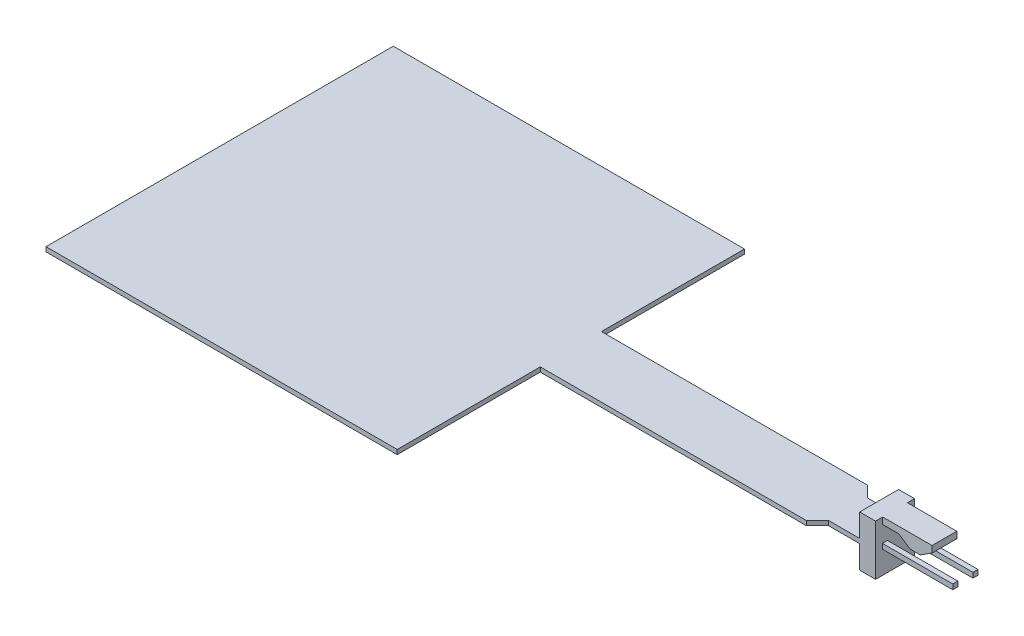
ISO-10303-21;
HEADER;
FILE_DESCRIPTION(('STEP AP214'),'2;1');
FILE_NAME('part.step','',(''),(''),'','','');
FILE_SCHEMA(('AUTOMOTIVE_DESIGN { 1 0 10303 214 1 1 1 1 }'));
ENDSEC;
DATA;
#1=APPLICATION_CONTEXT('core data for automotive mechanical design processes');
#2=APPLICATION_PROTOCOL_DEFINITION('international standard','automotive_design',2000,#1);
#3=PRODUCT_CONTEXT('',#1,'mechanical');
#4=PRODUCT('Part','Part','',(#3));
#5=PRODUCT_RELATED_PRODUCT_CATEGORY('part','',(#4));
#6=PRODUCT_DEFINITION_FORMATION('','',#4);
#7=PRODUCT_DEFINITION_CONTEXT('part definition',#1,'design');
#8=PRODUCT_DEFINITION('design','',#6,#7);
#9=PRODUCT_DEFINITION_SHAPE('','',#8);
#10=(LENGTH_UNIT() NAMED_UNIT(*) SI_UNIT(.MILLI.,.METRE.));
#11=(NAMED_UNIT(*) PLANE_ANGLE_UNIT() SI_UNIT($,.RADIAN.));
#12=(NAMED_UNIT(*) SI_UNIT($,.STERADIAN.) SOLID_ANGLE_UNIT());
#13=UNCERTAINTY_MEASURE_WITH_UNIT(LENGTH_MEASURE(1.E-05),#10,'distance_accuracy_value','');
#14=(GEOMETRIC_REPRESENTATION_CONTEXT(3) GLOBAL_UNCERTAINTY_ASSIGNED_CONTEXT((#13)) GLOBAL_UNIT_ASSIGNED_CONTEXT((#10,
#11,#12)) REPRESENTATION_CONTEXT('',''));
#15=CARTESIAN_POINT('',(0.,0.,0.));
#16=DIRECTION('',(0.,0.,1.));
#17=DIRECTION('',(1.,0.,0.));
#18=AXIS2_PLACEMENT_3D('',#15,#16,#17);
#19=CARTESIAN_POINT('',(62.9,0.,0.));
#20=DIRECTION('',(-1.,0.,0.));
#21=DIRECTION('',(0.,0.,1.));
#22=AXIS2_PLACEMENT_3D('',#19,#20,#21);
#23=PLANE('',#22);
#24=DIRECTION('',(0.,0.,-1.));
#25=VECTOR('',#24,1.);
#26=CARTESIAN_POINT('',(62.9,-0.3175,1.5875));
#27=LINE('',#26,#25);
#28=CARTESIAN_POINT('',(62.9,-0.3175,1.5875));
#29=VERTEX_POINT('',#28);
#30=CARTESIAN_POINT('',(62.9,-0.3175,0.9525));
#31=VERTEX_POINT('',#30);
#32=EDGE_CURVE('E289',#29,#31,#27,.T.);
#33=ORIENTED_EDGE('',*,*,#32,.F.);
#34=DIRECTION('',(0.,-1.,0.));
#35=VECTOR('',#34,1.);
#36=CARTESIAN_POINT('',(62.9,-0.3175,1.5875));
#37=LINE('',#36,#35);
#38=CARTESIAN_POINT('',(62.9,0.317500000000001,1.5875));
#39=VERTEX_POINT('',#38);
#40=EDGE_CURVE('E286',#39,#29,#37,.T.);
#41=ORIENTED_EDGE('',*,*,#40,.F.);
#42=DIRECTION('',(0.,0.,1.));
#43=VECTOR('',#42,1.);
#44=CARTESIAN_POINT('',(62.9,0.317500000000001,1.5875));
#45=LINE('',#44,#43);
#46=CARTESIAN_POINT('',(62.9,0.317500000000001,0.9525));
#47=VERTEX_POINT('',#46);
#48=EDGE_CURVE('E283',#47,#39,#45,.T.);
#49=ORIENTED_EDGE('',*,*,#48,.F.);
#50=DIRECTION('',(0.,1.,0.));
#51=VECTOR('',#50,1.);
#52=CARTESIAN_POINT('',(62.9,-0.3175,0.9525));
#53=LINE('',#52,#51);
#54=EDGE_CURVE('E280',#31,#47,#53,.T.);
#55=ORIENTED_EDGE('',*,*,#54,.F.);
#56=EDGE_LOOP('',(#33,#41,#49,#55));
#57=FACE_BOUND('',#56,.T.);
#58=DIRECTION('',(0.,0.,1.));
#59=VECTOR('',#58,1.);
#60=CARTESIAN_POINT('',(62.9,3.175,2.45));
#61=LINE('',#60,#59);
#62=CARTESIAN_POINT('',(62.9,3.175,-2.45));
#63=VERTEX_POINT('',#62);
#64=CARTESIAN_POINT('',(62.9,3.175,-1.555));
#65=VERTEX_POINT('',#64);
#66=EDGE_CURVE('E364',#63,#65,#61,.T.);
#67=ORIENTED_EDGE('',*,*,#66,.T.);
#68=DIRECTION('',(0.,-1.,0.));
#69=VECTOR('',#68,1.);
#70=CARTESIAN_POINT('',(62.9,2.355,-1.555));
#71=LINE('',#70,#69);
#72=CARTESIAN_POINT('',(62.9,2.355,-1.555));
#73=VERTEX_POINT('',#72);
#74=EDGE_CURVE('E279',#65,#73,#71,.T.);
#75=ORIENTED_EDGE('',*,*,#74,.T.);
#76=DIRECTION('',(0.,0.,-1.));
#77=VECTOR('',#76,1.);
#78=CARTESIAN_POINT('',(62.9,2.355,1.555));
#79=LINE('',#78,#77);
#80=CARTESIAN_POINT('',(62.9,2.355,1.555));
#81=VERTEX_POINT('',#80);
#82=EDGE_CURVE('E351',#81,#73,#79,.T.);
#83=ORIENTED_EDGE('',*,*,#82,.F.);
#84=DIRECTION('',(0.,-1.,0.));
#85=VECTOR('',#84,1.);
#86=CARTESIAN_POINT('',(62.9,2.355,1.555));
#87=LINE('',#86,#85);
#88=CARTESIAN_POINT('',(62.9,3.175,1.555));
#89=VERTEX_POINT('',#88);
#90=EDGE_CURVE('E306',#89,#81,#87,.T.);
#91=ORIENTED_EDGE('',*,*,#90,.F.);
#92=CARTESIAN_POINT('',(62.9,3.175,2.45));
#93=VERTEX_POINT('',#92);
#94=EDGE_CURVE('E363',#89,#93,#61,.T.);
#95=ORIENTED_EDGE('',*,*,#94,.T.);
#96=DIRECTION('',(0.,-1.,0.));
#97=VECTOR('',#96,1.);
#98=CARTESIAN_POINT('',(62.9,-3.175,2.45));
#99=LINE('',#98,#97);
#100=CARTESIAN_POINT('',(62.9,-3.175,2.45));
#101=VERTEX_POINT('',#100);
#102=EDGE_CURVE('E355',#93,#101,#99,.T.);
#103=ORIENTED_EDGE('',*,*,#102,.T.);
#104=DIRECTION('',(0.,0.,-1.));
#105=VECTOR('',#104,1.);
#106=CARTESIAN_POINT('',(62.9,-3.175,2.45));
#107=LINE('',#106,#105);
#108=CARTESIAN_POINT('',(62.9,-3.175,-2.45));
#109=VERTEX_POINT('',#108);
#110=EDGE_CURVE('E358',#101,#109,#107,.T.);
#111=ORIENTED_EDGE('',*,*,#110,.T.);
#112=DIRECTION('',(0.,1.,0.));
#113=VECTOR('',#112,1.);
#114=CARTESIAN_POINT('',(62.9,-3.175,-2.45));
#115=LINE('',#114,#113);
#116=EDGE_CURVE('E361',#109,#63,#115,.T.);
#117=ORIENTED_EDGE('',*,*,#116,.T.);
#118=EDGE_LOOP('',(#67,#75,#83,#91,#95,#103,#111,#117));
#119=FACE_BOUND('',#118,.T.);
#120=DIRECTION('',(0.,0.,-1.));
#121=VECTOR('',#120,1.);
#122=CARTESIAN_POINT('',(62.9,-0.3175,-0.9525));
#123=LINE('',#122,#121);
#124=CARTESIAN_POINT('',(62.9,-0.3175,-0.9525));
#125=VERTEX_POINT('',#124);
#126=CARTESIAN_POINT('',(62.9,-0.317499999999999,-1.5875));
#127=VERTEX_POINT('',#126);
#128=EDGE_CURVE('E49',#125,#127,#123,.T.);
#129=ORIENTED_EDGE('',*,*,#128,.F.);
#130=DIRECTION('',(0.,-1.,0.));
#131=VECTOR('',#130,1.);
#132=CARTESIAN_POINT('',(62.9,-0.3175,-0.9525));
#133=LINE('',#132,#131);
#134=CARTESIAN_POINT('',(62.9,0.317500000000001,-0.9525));
#135=VERTEX_POINT('',#134);
#136=EDGE_CURVE('E54',#135,#125,#133,.T.);
#137=ORIENTED_EDGE('',*,*,#136,.F.);
#138=DIRECTION('',(0.,0.,1.));
#139=VECTOR('',#138,1.);
#140=CARTESIAN_POINT('',(62.9,0.317500000000001,-0.9525));
#141=LINE('',#140,#139);
#142=CARTESIAN_POINT('',(62.9,0.317500000000001,-1.5875));
#143=VERTEX_POINT('',#142);
#144=EDGE_CURVE('E234',#143,#135,#141,.T.);
#145=ORIENTED_EDGE('',*,*,#144,.F.);
#146=DIRECTION('',(0.,1.,0.));
#147=VECTOR('',#146,1.);
#148=CARTESIAN_POINT('',(62.9,-0.317499999999999,-1.5875));
#149=LINE('',#148,#147);
#150=EDGE_CURVE('E237',#127,#143,#149,.T.);
#151=ORIENTED_EDGE('',*,*,#150,.F.);
#152=EDGE_LOOP('',(#129,#137,#145,#151));
#153=FACE_BOUND('',#152,.T.);
#154=ADVANCED_FACE('F34',(#57,#119,#153),#23,.F.);
#155=CARTESIAN_POINT('',(22.1,0.285,-3.85));
#156=DIRECTION('',(-1.,0.,0.));
#157=DIRECTION('',(0.,0.,1.));
#158=AXIS2_PLACEMENT_3D('',#155,#156,#157);
#159=PLANE('',#158);
#160=DIRECTION('',(0.,0.,-1.));
#161=VECTOR('',#160,1.);
#162=CARTESIAN_POINT('',(22.1,-0.285,-3.85));
#163=LINE('',#162,#161);
#164=CARTESIAN_POINT('',(22.1,-0.285,-3.85));
#165=VERTEX_POINT('',#164);
#166=CARTESIAN_POINT('',(22.1,-0.285,-21.85));
#167=VERTEX_POINT('',#166);
#168=EDGE_CURVE('E388',#165,#167,#163,.T.);
#169=ORIENTED_EDGE('',*,*,#168,.T.);
#170=DIRECTION('',(0.,-1.,0.));
#171=VECTOR('',#170,1.);
#172=CARTESIAN_POINT('',(22.1,0.285,-21.85));
#173=LINE('',#172,#171);
#174=CARTESIAN_POINT('',(22.1,0.285,-21.85));
#175=VERTEX_POINT('',#174);
#176=EDGE_CURVE('E12',#175,#167,#173,.T.);
#177=ORIENTED_EDGE('',*,*,#176,.F.);
#178=DIRECTION('',(0.,0.,-1.));
#179=VECTOR('',#178,1.);
#180=CARTESIAN_POINT('',(22.1,0.285,-3.85));
#181=LINE('',#180,#179);
#182=CARTESIAN_POINT('',(22.1,0.285,-3.85));
#183=VERTEX_POINT('',#182);
#184=EDGE_CURVE('E389',#183,#175,#181,.T.);
#185=ORIENTED_EDGE('',*,*,#184,.F.);
#186=DIRECTION('',(0.,-1.,0.));
#187=VECTOR('',#186,1.);
#188=CARTESIAN_POINT('',(22.1,0.285,-3.85));
#189=LINE('',#188,#187);
#190=EDGE_CURVE('E417',#183,#165,#189,.T.);
#191=ORIENTED_EDGE('',*,*,#190,.T.);
#192=EDGE_LOOP('',(#169,#177,#185,#191));
#193=FACE_BOUND('',#192,.T.);
#194=ADVANCED_FACE('F36',(#193),#159,.F.);
#195=CARTESIAN_POINT('',(-22.1,0.285,-21.85));
#196=DIRECTION('',(0.,0.,1.));
#197=DIRECTION('',(1.,0.,0.));
#198=AXIS2_PLACEMENT_3D('',#195,#196,#197);
#199=PLANE('',#198);
#200=DIRECTION('',(-1.,0.,0.));
#201=VECTOR('',#200,1.);
#202=CARTESIAN_POINT('',(-22.1,-0.285,-21.85));
#203=LINE('',#202,#201);
#204=CARTESIAN_POINT('',(-22.1,-0.285,-21.85));
#205=VERTEX_POINT('',#204);
#206=EDGE_CURVE('E420',#167,#205,#203,.T.);
#207=ORIENTED_EDGE('',*,*,#206,.T.);
#208=DIRECTION('',(0.,-1.,0.));
#209=VECTOR('',#208,1.);
#210=CARTESIAN_POINT('',(-22.1,0.285,-21.85));
#211=LINE('',#210,#209);
#212=CARTESIAN_POINT('',(-22.1,0.285,-21.85));
#213=VERTEX_POINT('',#212);
#214=EDGE_CURVE('E42',#213,#205,#211,.T.);
#215=ORIENTED_EDGE('',*,*,#214,.F.);
#216=DIRECTION('',(-1.,0.,0.));
#217=VECTOR('',#216,1.);
#218=CARTESIAN_POINT('',(-22.1,0.285,-21.85));
#219=LINE('',#218,#217);
#220=EDGE_CURVE('E392',#175,#213,#219,.T.);
#221=ORIENTED_EDGE('',*,*,#220,.F.);
#222=ORIENTED_EDGE('',*,*,#176,.T.);
#223=EDGE_LOOP('',(#207,#215,#221,#222));
#224=FACE_BOUND('',#223,.T.);
#225=ADVANCED_FACE('F492',(#224),#199,.F.);
#226=CARTESIAN_POINT('',(-22.1,0.285,21.85));
#227=DIRECTION('',(1.,0.,0.));
#228=DIRECTION('',(0.,0.,-1.));
#229=AXIS2_PLACEMENT_3D('',#226,#227,#228);
#230=PLANE('',#229);
#231=DIRECTION('',(0.,0.,1.));
#232=VECTOR('',#231,1.);
#233=CARTESIAN_POINT('',(-22.1,-0.285,21.85));
#234=LINE('',#233,#232);
#235=CARTESIAN_POINT('',(-22.1,-0.285,21.85));
#236=VERTEX_POINT('',#235);
#237=EDGE_CURVE('E422',#205,#236,#234,.T.);
#238=ORIENTED_EDGE('',*,*,#237,.T.);
#239=DIRECTION('',(0.,-1.,0.));
#240=VECTOR('',#239,1.);
#241=CARTESIAN_POINT('',(-22.1,0.285,21.85));
#242=LINE('',#241,#240);
#243=CARTESIAN_POINT('',(-22.1,0.285,21.85));
#244=VERTEX_POINT('',#243);
#245=EDGE_CURVE('E462',#244,#236,#242,.T.);
#246=ORIENTED_EDGE('',*,*,#245,.F.);
#247=DIRECTION('',(0.,0.,1.));
#248=VECTOR('',#247,1.);
#249=CARTESIAN_POINT('',(-22.1,0.285,21.85));
#250=LINE('',#249,#248);
#251=EDGE_CURVE('E395',#213,#244,#250,.T.);
#252=ORIENTED_EDGE('',*,*,#251,.F.);
#253=ORIENTED_EDGE('',*,*,#214,.T.);
#254=EDGE_LOOP('',(#238,#246,#252,#253));
#255=FACE_BOUND('',#254,.T.);
#256=ADVANCED_FACE('F469',(#255),#230,.F.);
#257=CARTESIAN_POINT('',(-22.1,0.285,21.85));
#258=DIRECTION('',(0.,0.,-1.));
#259=DIRECTION('',(-1.,0.,0.));
#260=AXIS2_PLACEMENT_3D('',#257,#258,#259);
#261=PLANE('',#260);
#262=DIRECTION('',(1.,0.,0.));
#263=VECTOR('',#262,1.);
#264=CARTESIAN_POINT('',(-22.1,-0.285,21.85));
#265=LINE('',#264,#263);
#266=CARTESIAN_POINT('',(22.1,-0.285,21.85));
#267=VERTEX_POINT('',#266);
#268=EDGE_CURVE('E424',#236,#267,#265,.T.);
#269=ORIENTED_EDGE('',*,*,#268,.T.);
#270=DIRECTION('',(0.,-1.,0.));
#271=VECTOR('',#270,1.);
#272=CARTESIAN_POINT('',(22.1,0.285,21.85));
#273=LINE('',#272,#271);
#274=CARTESIAN_POINT('',(22.1,0.285,21.85));
#275=VERTEX_POINT('',#274);
#276=EDGE_CURVE('E459',#275,#267,#273,.T.);
#277=ORIENTED_EDGE('',*,*,#276,.F.);
#278=DIRECTION('',(1.,0.,0.));
#279=VECTOR('',#278,1.);
#280=CARTESIAN_POINT('',(-22.1,0.285,21.85));
#281=LINE('',#280,#279);
#282=EDGE_CURVE('E397',#244,#275,#281,.T.);
#283=ORIENTED_EDGE('',*,*,#282,.F.);
#284=ORIENTED_EDGE('',*,*,#245,.T.);
#285=EDGE_LOOP('',(#269,#277,#283,#284));
#286=FACE_BOUND('',#285,.T.);
#287=ADVANCED_FACE('F480',(#286),#261,.F.);
#288=CARTESIAN_POINT('',(22.1,0.285,21.85));
#289=DIRECTION('',(-1.,0.,0.));
#290=DIRECTION('',(0.,0.,1.));
#291=AXIS2_PLACEMENT_3D('',#288,#289,#290);
#292=PLANE('',#291);
#293=DIRECTION('',(0.,0.,-1.));
#294=VECTOR('',#293,1.);
#295=CARTESIAN_POINT('',(22.1,-0.285,21.85));
#296=LINE('',#295,#294);
#297=CARTESIAN_POINT('',(22.1,-0.285,3.85));
#298=VERTEX_POINT('',#297);
#299=EDGE_CURVE('E426',#267,#298,#296,.T.);
#300=ORIENTED_EDGE('',*,*,#299,.T.);
#301=DIRECTION('',(0.,-1.,0.));
#302=VECTOR('',#301,1.);
#303=CARTESIAN_POINT('',(22.1,0.285,3.85));
#304=LINE('',#303,#302);
#305=CARTESIAN_POINT('',(22.1,0.285,3.85));
#306=VERTEX_POINT('',#305);
#307=EDGE_CURVE('E456',#306,#298,#304,.T.);
#308=ORIENTED_EDGE('',*,*,#307,.F.);
#309=DIRECTION('',(0.,0.,-1.));
#310=VECTOR('',#309,1.);
#311=CARTESIAN_POINT('',(22.1,0.285,21.85));
#312=LINE('',#311,#310);
#313=EDGE_CURVE('E399',#275,#306,#312,.T.);
#314=ORIENTED_EDGE('',*,*,#313,.F.);
#315=ORIENTED_EDGE('',*,*,#276,.T.);
#316=EDGE_LOOP('',(#300,#308,#314,#315));
#317=FACE_BOUND('',#316,.T.);
#318=ADVANCED_FACE('F484',(#317),#292,.F.);
#319=CARTESIAN_POINT('',(22.1,0.285,3.85));
#320=DIRECTION('',(0.,0.,-1.));
#321=DIRECTION('',(-1.,0.,0.));
#322=AXIS2_PLACEMENT_3D('',#319,#320,#321);
#323=PLANE('',#322);
#324=DIRECTION('',(1.,0.,0.));
#325=VECTOR('',#324,1.);
#326=CARTESIAN_POINT('',(22.1,-0.285,3.85));
#327=LINE('',#326,#325);
#328=CARTESIAN_POINT('',(55.58,-0.285,3.85));
#329=VERTEX_POINT('',#328);
#330=EDGE_CURVE('E428',#298,#329,#327,.T.);
#331=ORIENTED_EDGE('',*,*,#330,.T.);
#332=DIRECTION('',(0.,-1.,0.));
#333=VECTOR('',#332,1.);
#334=CARTESIAN_POINT('',(55.58,0.285,3.85));
#335=LINE('',#334,#333);
#336=CARTESIAN_POINT('',(55.58,0.285,3.85));
#337=VERTEX_POINT('',#336);
#338=EDGE_CURVE('E453',#337,#329,#335,.T.);
#339=ORIENTED_EDGE('',*,*,#338,.F.);
#340=DIRECTION('',(1.,0.,0.));
#341=VECTOR('',#340,1.);
#342=CARTESIAN_POINT('',(22.1,0.285,3.85));
#343=LINE('',#342,#341);
#344=EDGE_CURVE('E401',#306,#337,#343,.T.);
#345=ORIENTED_EDGE('',*,*,#344,.F.);
#346=ORIENTED_EDGE('',*,*,#307,.T.);
#347=EDGE_LOOP('',(#331,#339,#345,#346));
#348=FACE_BOUND('',#347,.T.);
#349=ADVANCED_FACE('F525',(#348),#323,.F.);
#350=CARTESIAN_POINT('',(56.98,0.285,2.45));
#351=DIRECTION('',(-0.707106781186546,0.,-0.707106781186549));
#352=DIRECTION('',(-0.707106781186549,0.,0.707106781186546));
#353=AXIS2_PLACEMENT_3D('',#350,#351,#352);
#354=PLANE('',#353);
#355=DIRECTION('',(0.707106781186549,0.,-0.707106781186546));
#356=VECTOR('',#355,1.);
#357=CARTESIAN_POINT('',(56.98,-0.285,2.45));
#358=LINE('',#357,#356);
#359=CARTESIAN_POINT('',(56.98,-0.285,2.45));
#360=VERTEX_POINT('',#359);
#361=EDGE_CURVE('E430',#329,#360,#358,.T.);
#362=ORIENTED_EDGE('',*,*,#361,.T.);
#363=DIRECTION('',(0.,-1.,0.));
#364=VECTOR('',#363,1.);
#365=CARTESIAN_POINT('',(56.98,0.285,2.45));
#366=LINE('',#365,#364);
#367=CARTESIAN_POINT('',(56.98,0.285,2.45));
#368=VERTEX_POINT('',#367);
#369=EDGE_CURVE('E450',#368,#360,#366,.T.);
#370=ORIENTED_EDGE('',*,*,#369,.F.);
#371=DIRECTION('',(0.707106781186549,0.,-0.707106781186546));
#372=VECTOR('',#371,1.);
#373=CARTESIAN_POINT('',(56.98,0.285,2.45));
#374=LINE('',#373,#372);
#375=EDGE_CURVE('E403',#337,#368,#374,.T.);
#376=ORIENTED_EDGE('',*,*,#375,.F.);
#377=ORIENTED_EDGE('',*,*,#338,.T.);
#378=EDGE_LOOP('',(#362,#370,#376,#377));
#379=FACE_BOUND('',#378,.T.);
#380=ADVANCED_FACE('F523',(#379),#354,.F.);
#381=CARTESIAN_POINT('',(60.9,0.285,2.45));
#382=DIRECTION('',(0.,0.,-1.));
#383=DIRECTION('',(-1.,0.,0.));
#384=AXIS2_PLACEMENT_3D('',#381,#382,#383);
#385=PLANE('',#384);
#386=DIRECTION('',(1.,0.,0.));
#387=VECTOR('',#386,1.);
#388=CARTESIAN_POINT('',(60.9,-0.285,2.45));
#389=LINE('',#388,#387);
#390=CARTESIAN_POINT('',(60.9,-0.285,2.45));
#391=VERTEX_POINT('',#390);
#392=EDGE_CURVE('E432',#360,#391,#389,.T.);
#393=ORIENTED_EDGE('',*,*,#392,.T.);
#394=DIRECTION('',(0.,-1.,0.));
#395=VECTOR('',#394,1.);
#396=CARTESIAN_POINT('',(60.9,-3.175,2.45));
#397=LINE('',#396,#395);
#398=CARTESIAN_POINT('',(60.9,-3.175,2.45));
#399=VERTEX_POINT('',#398);
#400=EDGE_CURVE('E354',#391,#399,#397,.T.);
#401=ORIENTED_EDGE('',*,*,#400,.T.);
#402=DIRECTION('',(-1.,0.,0.));
#403=VECTOR('',#402,1.);
#404=CARTESIAN_POINT('',(62.9,-3.175,2.45));
#405=LINE('',#404,#403);
#406=EDGE_CURVE('E385',#101,#399,#405,.T.);
#407=ORIENTED_EDGE('',*,*,#406,.F.);
#408=ORIENTED_EDGE('',*,*,#102,.F.);
#409=DIRECTION('',(-1.,0.,0.));
#410=VECTOR('',#409,1.);
#411=CARTESIAN_POINT('',(62.9,3.175,2.45));
#412=LINE('',#411,#410);
#413=CARTESIAN_POINT('',(60.9,3.175,2.45));
#414=VERTEX_POINT('',#413);
#415=EDGE_CURVE('E366',#93,#414,#412,.T.);
#416=ORIENTED_EDGE('',*,*,#415,.T.);
#417=CARTESIAN_POINT('',(60.9,0.285,2.45));
#418=VERTEX_POINT('',#417);
#419=EDGE_CURVE('E367',#414,#418,#397,.T.);
#420=ORIENTED_EDGE('',*,*,#419,.T.);
#421=DIRECTION('',(1.,0.,0.));
#422=VECTOR('',#421,1.);
#423=CARTESIAN_POINT('',(60.9,0.285,2.45));
#424=LINE('',#423,#422);
#425=EDGE_CURVE('E405',#368,#418,#424,.T.);
#426=ORIENTED_EDGE('',*,*,#425,.F.);
#427=ORIENTED_EDGE('',*,*,#369,.T.);
#428=EDGE_LOOP('',(#393,#401,#407,#408,#416,#420,#426,#427));
#429=FACE_BOUND('',#428,.T.);
#430=ADVANCED_FACE('F518',(#429),#385,.F.);
#431=CARTESIAN_POINT('',(56.98,0.285,-2.45));
#432=DIRECTION('',(0.,0.,1.));
#433=DIRECTION('',(1.,0.,0.));
#434=AXIS2_PLACEMENT_3D('',#431,#432,#433);
#435=PLANE('',#434);
#436=DIRECTION('',(-1.,0.,0.));
#437=VECTOR('',#436,1.);
#438=CARTESIAN_POINT('',(56.98,-0.285,-2.45));
#439=LINE('',#438,#437);
#440=CARTESIAN_POINT('',(60.9,-0.285,-2.45));
#441=VERTEX_POINT('',#440);
#442=CARTESIAN_POINT('',(56.98,-0.285,-2.45));
#443=VERTEX_POINT('',#442);
#444=EDGE_CURVE('E437',#441,#443,#439,.T.);
#445=ORIENTED_EDGE('',*,*,#444,.T.);
#446=DIRECTION('',(0.,-1.,0.));
#447=VECTOR('',#446,1.);
#448=CARTESIAN_POINT('',(56.98,0.285,-2.45));
#449=LINE('',#448,#447);
#450=CARTESIAN_POINT('',(56.98,0.285,-2.45));
#451=VERTEX_POINT('',#450);
#452=EDGE_CURVE('E447',#451,#443,#449,.T.);
#453=ORIENTED_EDGE('',*,*,#452,.F.);
#454=DIRECTION('',(-1.,0.,0.));
#455=VECTOR('',#454,1.);
#456=CARTESIAN_POINT('',(56.98,0.285,-2.45));
#457=LINE('',#456,#455);
#458=CARTESIAN_POINT('',(60.9,0.285,-2.45));
#459=VERTEX_POINT('',#458);
#460=EDGE_CURVE('E411',#459,#451,#457,.T.);
#461=ORIENTED_EDGE('',*,*,#460,.F.);
#462=DIRECTION('',(0.,1.,0.));
#463=VECTOR('',#462,1.);
#464=CARTESIAN_POINT('',(60.9,-3.175,-2.45));
#465=LINE('',#464,#463);
#466=CARTESIAN_POINT('',(60.9,3.175,-2.45));
#467=VERTEX_POINT('',#466);
#468=EDGE_CURVE('E372',#459,#467,#465,.T.);
#469=ORIENTED_EDGE('',*,*,#468,.T.);
#470=DIRECTION('',(-1.,0.,0.));
#471=VECTOR('',#470,1.);
#472=CARTESIAN_POINT('',(62.9,3.175,-2.45));
#473=LINE('',#472,#471);
#474=EDGE_CURVE('E379',#63,#467,#473,.T.);
#475=ORIENTED_EDGE('',*,*,#474,.F.);
#476=ORIENTED_EDGE('',*,*,#116,.F.);
#477=DIRECTION('',(-1.,0.,0.));
#478=VECTOR('',#477,1.);
#479=CARTESIAN_POINT('',(62.9,-3.175,-2.45));
#480=LINE('',#479,#478);
#481=CARTESIAN_POINT('',(60.9,-3.175,-2.45));
#482=VERTEX_POINT('',#481);
#483=EDGE_CURVE('E382',#109,#482,#480,.T.);
#484=ORIENTED_EDGE('',*,*,#483,.T.);
#485=EDGE_CURVE('E373',#482,#441,#465,.T.);
#486=ORIENTED_EDGE('',*,*,#485,.T.);
#487=EDGE_LOOP('',(#445,#453,#461,#469,#475,#476,#484,#486));
#488=FACE_BOUND('',#487,.T.);
#489=ADVANCED_FACE('F508',(#488),#435,.F.);
#490=CARTESIAN_POINT('',(55.58,0.285,-3.85));
#491=DIRECTION('',(-0.707106781186546,0.,0.707106781186549));
#492=DIRECTION('',(0.707106781186549,0.,0.707106781186546));
#493=AXIS2_PLACEMENT_3D('',#490,#491,#492);
#494=PLANE('',#493);
#495=DIRECTION('',(-0.707106781186549,0.,-0.707106781186546));
#496=VECTOR('',#495,1.);
#497=CARTESIAN_POINT('',(55.58,-0.285,-3.85));
#498=LINE('',#497,#496);
#499=CARTESIAN_POINT('',(55.58,-0.285,-3.85));
#500=VERTEX_POINT('',#499);
#501=EDGE_CURVE('E439',#443,#500,#498,.T.);
#502=ORIENTED_EDGE('',*,*,#501,.T.);
#503=DIRECTION('',(0.,-1.,0.));
#504=VECTOR('',#503,1.);
#505=CARTESIAN_POINT('',(55.58,0.285,-3.85));
#506=LINE('',#505,#504);
#507=CARTESIAN_POINT('',(55.58,0.285,-3.85));
#508=VERTEX_POINT('',#507);
#509=EDGE_CURVE('E444',#508,#500,#506,.T.);
#510=ORIENTED_EDGE('',*,*,#509,.F.);
#511=DIRECTION('',(-0.707106781186549,0.,-0.707106781186546));
#512=VECTOR('',#511,1.);
#513=CARTESIAN_POINT('',(55.58,0.285,-3.85));
#514=LINE('',#513,#512);
#515=EDGE_CURVE('E413',#451,#508,#514,.T.);
#516=ORIENTED_EDGE('',*,*,#515,.F.);
#517=ORIENTED_EDGE('',*,*,#452,.T.);
#518=EDGE_LOOP('',(#502,#510,#516,#517));
#519=FACE_BOUND('',#518,.T.);
#520=ADVANCED_FACE('F504',(#519),#494,.F.);
#521=CARTESIAN_POINT('',(22.1,0.285,-3.85));
#522=DIRECTION('',(0.,0.,1.));
#523=DIRECTION('',(1.,0.,0.));
#524=AXIS2_PLACEMENT_3D('',#521,#522,#523);
#525=PLANE('',#524);
#526=DIRECTION('',(-1.,0.,0.));
#527=VECTOR('',#526,1.);
#528=CARTESIAN_POINT('',(22.1,-0.285,-3.85));
#529=LINE('',#528,#527);
#530=EDGE_CURVE('E393',#500,#165,#529,.T.);
#531=ORIENTED_EDGE('',*,*,#530,.T.);
#532=ORIENTED_EDGE('',*,*,#190,.F.);
#533=DIRECTION('',(-1.,0.,0.));
#534=VECTOR('',#533,1.);
#535=CARTESIAN_POINT('',(22.1,0.285,-3.85));
#536=LINE('',#535,#534);
#537=EDGE_CURVE('E415',#508,#183,#536,.T.);
#538=ORIENTED_EDGE('',*,*,#537,.F.);
#539=ORIENTED_EDGE('',*,*,#509,.T.);
#540=EDGE_LOOP('',(#531,#532,#538,#539));
#541=FACE_BOUND('',#540,.T.);
#542=ADVANCED_FACE('F499',(#541),#525,.F.);
#543=CARTESIAN_POINT('',(0.,0.285,0.));
#544=DIRECTION('',(0.,-1.,0.));
#545=DIRECTION('',(0.,0.,-1.));
#546=AXIS2_PLACEMENT_3D('',#543,#544,#545);
#547=PLANE('',#546);
#548=ORIENTED_EDGE('',*,*,#184,.T.);
#549=ORIENTED_EDGE('',*,*,#220,.T.);
#550=ORIENTED_EDGE('',*,*,#251,.T.);
#551=ORIENTED_EDGE('',*,*,#282,.T.);
#552=ORIENTED_EDGE('',*,*,#313,.T.);
#553=ORIENTED_EDGE('',*,*,#344,.T.);
#554=ORIENTED_EDGE('',*,*,#375,.T.);
#555=ORIENTED_EDGE('',*,*,#425,.T.);
#556=DIRECTION('',(0.,0.,-1.));
#557=VECTOR('',#556,1.);
#558=CARTESIAN_POINT('',(60.9,0.285,-2.45));
#559=LINE('',#558,#557);
#560=EDGE_CURVE('E408',#418,#459,#559,.T.);
#561=ORIENTED_EDGE('',*,*,#560,.T.);
#562=ORIENTED_EDGE('',*,*,#460,.T.);
#563=ORIENTED_EDGE('',*,*,#515,.T.);
#564=ORIENTED_EDGE('',*,*,#537,.T.);
#565=EDGE_LOOP('',(#548,#549,#550,#551,#552,#553,#554,#555,#561,#562,#563,#564));
#566=FACE_BOUND('',#565,.T.);
#567=ADVANCED_FACE('F488',(#566),#547,.F.);
#568=CARTESIAN_POINT('',(0.,-0.285,0.));
#569=DIRECTION('',(0.,-1.,0.));
#570=DIRECTION('',(0.,0.,-1.));
#571=AXIS2_PLACEMENT_3D('',#568,#569,#570);
#572=PLANE('',#571);
#573=ORIENTED_EDGE('',*,*,#168,.F.);
#574=ORIENTED_EDGE('',*,*,#530,.F.);
#575=ORIENTED_EDGE('',*,*,#501,.F.);
#576=ORIENTED_EDGE('',*,*,#444,.F.);
#577=DIRECTION('',(0.,0.,-1.));
#578=VECTOR('',#577,1.);
#579=CARTESIAN_POINT('',(60.9,-0.285,-2.45));
#580=LINE('',#579,#578);
#581=EDGE_CURVE('E435',#391,#441,#580,.T.);
#582=ORIENTED_EDGE('',*,*,#581,.F.);
#583=ORIENTED_EDGE('',*,*,#392,.F.);
#584=ORIENTED_EDGE('',*,*,#361,.F.);
#585=ORIENTED_EDGE('',*,*,#330,.F.);
#586=ORIENTED_EDGE('',*,*,#299,.F.);
#587=ORIENTED_EDGE('',*,*,#268,.F.);
#588=ORIENTED_EDGE('',*,*,#237,.F.);
#589=ORIENTED_EDGE('',*,*,#206,.F.);
#590=EDGE_LOOP('',(#573,#574,#575,#576,#582,#583,#584,#585,#586,#587,#588,#589));
#591=FACE_BOUND('',#590,.T.);
#592=ADVANCED_FACE('F475',(#591),#572,.T.);
#593=CARTESIAN_POINT('',(60.9,0.,0.));
#594=DIRECTION('',(-1.,0.,0.));
#595=DIRECTION('',(0.,0.,1.));
#596=AXIS2_PLACEMENT_3D('',#593,#594,#595);
#597=PLANE('',#596);
#598=ORIENTED_EDGE('',*,*,#560,.F.);
#599=ORIENTED_EDGE('',*,*,#419,.F.);
#600=DIRECTION('',(0.,0.,1.));
#601=VECTOR('',#600,1.);
#602=CARTESIAN_POINT('',(60.9,3.175,2.45));
#603=LINE('',#602,#601);
#604=EDGE_CURVE('E359',#467,#414,#603,.T.);
#605=ORIENTED_EDGE('',*,*,#604,.F.);
#606=ORIENTED_EDGE('',*,*,#468,.F.);
#607=EDGE_LOOP('',(#598,#599,#605,#606));
#608=FACE_BOUND('',#607,.T.);
#609=ADVANCED_FACE('F548',(#608),#597,.T.);
#610=CARTESIAN_POINT('',(62.9,-3.175,2.45));
#611=DIRECTION('',(0.,1.,0.));
#612=DIRECTION('',(0.,0.,1.));
#613=AXIS2_PLACEMENT_3D('',#610,#611,#612);
#614=PLANE('',#613);
#615=DIRECTION('',(0.,0.,-1.));
#616=VECTOR('',#615,1.);
#617=CARTESIAN_POINT('',(60.9,-3.175,2.45));
#618=LINE('',#617,#616);
#619=EDGE_CURVE('E370',#399,#482,#618,.T.);
#620=ORIENTED_EDGE('',*,*,#619,.T.);
#621=ORIENTED_EDGE('',*,*,#483,.F.);
#622=ORIENTED_EDGE('',*,*,#110,.F.);
#623=ORIENTED_EDGE('',*,*,#406,.T.);
#624=EDGE_LOOP('',(#620,#621,#622,#623));
#625=FACE_BOUND('',#624,.T.);
#626=ADVANCED_FACE('F551',(#625),#614,.F.);
#627=CARTESIAN_POINT('',(62.9,3.175,2.45));
#628=DIRECTION('',(0.,-1.,0.));
#629=DIRECTION('',(0.,0.,-1.));
#630=AXIS2_PLACEMENT_3D('',#627,#628,#629);
#631=PLANE('',#630);
#632=ORIENTED_EDGE('',*,*,#604,.T.);
#633=ORIENTED_EDGE('',*,*,#415,.F.);
#634=ORIENTED_EDGE('',*,*,#94,.F.);
#635=DIRECTION('',(-1.,0.,0.));
#636=VECTOR('',#635,1.);
#637=CARTESIAN_POINT('',(62.9,3.175,1.555));
#638=LINE('',#637,#636);
#639=CARTESIAN_POINT('',(69.11,3.175,1.555));
#640=VERTEX_POINT('',#639);
#641=EDGE_CURVE('E320',#640,#89,#638,.T.);
#642=ORIENTED_EDGE('',*,*,#641,.F.);
#643=DIRECTION('',(0.,0.,-1.));
#644=VECTOR('',#643,1.);
#645=CARTESIAN_POINT('',(69.11,3.175,1.555));
#646=LINE('',#645,#644);
#647=CARTESIAN_POINT('',(69.11,3.175,-1.555));
#648=VERTEX_POINT('',#647);
#649=EDGE_CURVE('E323',#640,#648,#646,.T.);
#650=ORIENTED_EDGE('',*,*,#649,.T.);
#651=DIRECTION('',(-1.,0.,0.));
#652=VECTOR('',#651,1.);
#653=CARTESIAN_POINT('',(62.9,3.175,-1.555));
#654=LINE('',#653,#652);
#655=EDGE_CURVE('E310',#648,#65,#654,.T.);
#656=ORIENTED_EDGE('',*,*,#655,.T.);
#657=ORIENTED_EDGE('',*,*,#66,.F.);
#658=ORIENTED_EDGE('',*,*,#474,.T.);
#659=EDGE_LOOP('',(#632,#633,#634,#642,#650,#656,#657,#658));
#660=FACE_BOUND('',#659,.T.);
#661=ADVANCED_FACE('F547',(#660),#631,.F.);
#662=ORIENTED_EDGE('',*,*,#400,.F.);
#663=ORIENTED_EDGE('',*,*,#581,.T.);
#664=ORIENTED_EDGE('',*,*,#485,.F.);
#665=ORIENTED_EDGE('',*,*,#619,.F.);
#666=EDGE_LOOP('',(#662,#663,#664,#665));
#667=FACE_BOUND('',#666,.T.);
#668=ADVANCED_FACE('F514',(#667),#597,.T.);
#669=CARTESIAN_POINT('',(64.9,2.355,1.555));
#670=DIRECTION('',(0.,1.,0.));
#671=DIRECTION('',(0.,0.,1.));
#672=AXIS2_PLACEMENT_3D('',#669,#670,#671);
#673=PLANE('',#672);
#674=DIRECTION('',(1.,0.,0.));
#675=VECTOR('',#674,1.);
#676=CARTESIAN_POINT('',(64.9,2.355,-1.555));
#677=LINE('',#676,#675);
#678=CARTESIAN_POINT('',(64.9,2.355,-1.555));
#679=VERTEX_POINT('',#678);
#680=EDGE_CURVE('E325',#73,#679,#677,.T.);
#681=ORIENTED_EDGE('',*,*,#680,.T.);
#682=DIRECTION('',(0.,0.,-1.));
#683=VECTOR('',#682,1.);
#684=CARTESIAN_POINT('',(64.9,2.355,1.555));
#685=LINE('',#684,#683);
#686=CARTESIAN_POINT('',(64.9,2.355,1.555));
#687=VERTEX_POINT('',#686);
#688=EDGE_CURVE('E348',#687,#679,#685,.T.);
#689=ORIENTED_EDGE('',*,*,#688,.F.);
#690=DIRECTION('',(1.,0.,0.));
#691=VECTOR('',#690,1.);
#692=CARTESIAN_POINT('',(64.9,2.355,1.555));
#693=LINE('',#692,#691);
#694=EDGE_CURVE('E309',#81,#687,#693,.T.);
#695=ORIENTED_EDGE('',*,*,#694,.F.);
#696=ORIENTED_EDGE('',*,*,#82,.T.);
#697=EDGE_LOOP('',(#681,#689,#695,#696));
#698=FACE_BOUND('',#697,.T.);
#699=ADVANCED_FACE('F543',(#698),#673,.F.);
#700=CARTESIAN_POINT('',(66.38,1.405,1.555));
#701=DIRECTION('',(0.540182693447415,0.841547775054926,0.));
#702=DIRECTION('',(-0.841547775054926,0.540182693447415,0.));
#703=AXIS2_PLACEMENT_3D('',#700,#701,#702);
#704=PLANE('',#703);
#705=DIRECTION('',(0.841547775054926,-0.540182693447415,0.));
#706=VECTOR('',#705,1.);
#707=CARTESIAN_POINT('',(66.38,1.405,-1.555));
#708=LINE('',#707,#706);
#709=CARTESIAN_POINT('',(66.38,1.405,-1.555));
#710=VERTEX_POINT('',#709);
#711=EDGE_CURVE('E327',#679,#710,#708,.T.);
#712=ORIENTED_EDGE('',*,*,#711,.T.);
#713=DIRECTION('',(0.,0.,-1.));
#714=VECTOR('',#713,1.);
#715=CARTESIAN_POINT('',(66.38,1.405,1.555));
#716=LINE('',#715,#714);
#717=CARTESIAN_POINT('',(66.38,1.405,1.555));
#718=VERTEX_POINT('',#717);
#719=EDGE_CURVE('E345',#718,#710,#716,.T.);
#720=ORIENTED_EDGE('',*,*,#719,.F.);
#721=DIRECTION('',(0.841547775054926,-0.540182693447415,0.));
#722=VECTOR('',#721,1.);
#723=CARTESIAN_POINT('',(66.38,1.405,1.555));
#724=LINE('',#723,#722);
#725=EDGE_CURVE('E312',#687,#718,#724,.T.);
#726=ORIENTED_EDGE('',*,*,#725,.F.);
#727=ORIENTED_EDGE('',*,*,#688,.T.);
#728=EDGE_LOOP('',(#712,#720,#726,#727));
#729=FACE_BOUND('',#728,.T.);
#730=ADVANCED_FACE('F615',(#729),#704,.F.);
#731=CARTESIAN_POINT('',(67.63,1.405,1.555));
#732=DIRECTION('',(0.,1.,0.));
#733=DIRECTION('',(0.,0.,1.));
#734=AXIS2_PLACEMENT_3D('',#731,#732,#733);
#735=PLANE('',#734);
#736=DIRECTION('',(1.,0.,0.));
#737=VECTOR('',#736,1.);
#738=CARTESIAN_POINT('',(67.63,1.405,-1.555));
#739=LINE('',#738,#737);
#740=CARTESIAN_POINT('',(67.63,1.405,-1.555));
#741=VERTEX_POINT('',#740);
#742=EDGE_CURVE('E329',#710,#741,#739,.T.);
#743=ORIENTED_EDGE('',*,*,#742,.T.);
#744=DIRECTION('',(0.,0.,-1.));
#745=VECTOR('',#744,1.);
#746=CARTESIAN_POINT('',(67.63,1.405,1.555));
#747=LINE('',#746,#745);
#748=CARTESIAN_POINT('',(67.63,1.405,1.555));
#749=VERTEX_POINT('',#748);
#750=EDGE_CURVE('E342',#749,#741,#747,.T.);
#751=ORIENTED_EDGE('',*,*,#750,.F.);
#752=DIRECTION('',(1.,0.,0.));
#753=VECTOR('',#752,1.);
#754=CARTESIAN_POINT('',(67.63,1.405,1.555));
#755=LINE('',#754,#753);
#756=EDGE_CURVE('E314',#718,#749,#755,.T.);
#757=ORIENTED_EDGE('',*,*,#756,.F.);
#758=ORIENTED_EDGE('',*,*,#719,.T.);
#759=EDGE_LOOP('',(#743,#751,#757,#758));
#760=FACE_BOUND('',#759,.T.);
#761=ADVANCED_FACE('F622',(#760),#735,.F.);
#762=CARTESIAN_POINT('',(69.11,2.355,1.555));
#763=DIRECTION('',(-0.540182693447419,0.841547775054923,0.));
#764=DIRECTION('',(-0.841547775054924,-0.540182693447419,0.));
#765=AXIS2_PLACEMENT_3D('',#762,#763,#764);
#766=PLANE('',#765);
#767=DIRECTION('',(0.841547775054923,0.540182693447419,0.));
#768=VECTOR('',#767,1.);
#769=CARTESIAN_POINT('',(69.11,2.355,-1.555));
#770=LINE('',#769,#768);
#771=CARTESIAN_POINT('',(69.11,2.355,-1.555));
#772=VERTEX_POINT('',#771);
#773=EDGE_CURVE('E331',#741,#772,#770,.T.);
#774=ORIENTED_EDGE('',*,*,#773,.T.);
#775=DIRECTION('',(0.,0.,-1.));
#776=VECTOR('',#775,1.);
#777=CARTESIAN_POINT('',(69.11,2.355,1.555));
#778=LINE('',#777,#776);
#779=CARTESIAN_POINT('',(69.11,2.355,1.555));
#780=VERTEX_POINT('',#779);
#781=EDGE_CURVE('E339',#780,#772,#778,.T.);
#782=ORIENTED_EDGE('',*,*,#781,.F.);
#783=DIRECTION('',(0.841547775054923,0.540182693447419,0.));
#784=VECTOR('',#783,1.);
#785=CARTESIAN_POINT('',(69.11,2.355,1.555));
#786=LINE('',#785,#784);
#787=EDGE_CURVE('E316',#749,#780,#786,.T.);
#788=ORIENTED_EDGE('',*,*,#787,.F.);
#789=ORIENTED_EDGE('',*,*,#750,.T.);
#790=EDGE_LOOP('',(#774,#782,#788,#789));
#791=FACE_BOUND('',#790,.T.);
#792=ADVANCED_FACE('F629',(#791),#766,.F.);
#793=CARTESIAN_POINT('',(69.11,3.175,1.555));
#794=DIRECTION('',(-1.,0.,0.));
#795=DIRECTION('',(0.,0.,1.));
#796=AXIS2_PLACEMENT_3D('',#793,#794,#795);
#797=PLANE('',#796);
#798=DIRECTION('',(0.,1.,0.));
#799=VECTOR('',#798,1.);
#800=CARTESIAN_POINT('',(69.11,3.175,-1.555));
#801=LINE('',#800,#799);
#802=EDGE_CURVE('E333',#772,#648,#801,.T.);
#803=ORIENTED_EDGE('',*,*,#802,.T.);
#804=ORIENTED_EDGE('',*,*,#649,.F.);
#805=DIRECTION('',(0.,1.,0.));
#806=VECTOR('',#805,1.);
#807=CARTESIAN_POINT('',(69.11,3.175,1.555));
#808=LINE('',#807,#806);
#809=EDGE_CURVE('E318',#780,#640,#808,.T.);
#810=ORIENTED_EDGE('',*,*,#809,.F.);
#811=ORIENTED_EDGE('',*,*,#781,.T.);
#812=EDGE_LOOP('',(#803,#804,#810,#811));
#813=FACE_BOUND('',#812,.T.);
#814=ADVANCED_FACE('F637',(#813),#797,.F.);
#815=CARTESIAN_POINT('',(0.,0.,1.555));
#816=DIRECTION('',(0.,0.,-1.));
#817=DIRECTION('',(-1.,0.,0.));
#818=AXIS2_PLACEMENT_3D('',#815,#816,#817);
#819=PLANE('',#818);
#820=ORIENTED_EDGE('',*,*,#90,.T.);
#821=ORIENTED_EDGE('',*,*,#694,.T.);
#822=ORIENTED_EDGE('',*,*,#725,.T.);
#823=ORIENTED_EDGE('',*,*,#756,.T.);
#824=ORIENTED_EDGE('',*,*,#787,.T.);
#825=ORIENTED_EDGE('',*,*,#809,.T.);
#826=ORIENTED_EDGE('',*,*,#641,.T.);
#827=EDGE_LOOP('',(#820,#821,#822,#823,#824,#825,#826));
#828=FACE_BOUND('',#827,.T.);
#829=ADVANCED_FACE('F645',(#828),#819,.F.);
#830=CARTESIAN_POINT('',(0.,0.,-1.555));
#831=DIRECTION('',(0.,0.,-1.));
#832=DIRECTION('',(-1.,0.,0.));
#833=AXIS2_PLACEMENT_3D('',#830,#831,#832);
#834=PLANE('',#833);
#835=ORIENTED_EDGE('',*,*,#74,.F.);
#836=ORIENTED_EDGE('',*,*,#655,.F.);
#837=ORIENTED_EDGE('',*,*,#802,.F.);
#838=ORIENTED_EDGE('',*,*,#773,.F.);
#839=ORIENTED_EDGE('',*,*,#742,.F.);
#840=ORIENTED_EDGE('',*,*,#711,.F.);
#841=ORIENTED_EDGE('',*,*,#680,.F.);
#842=EDGE_LOOP('',(#835,#836,#837,#838,#839,#840,#841));
#843=FACE_BOUND('',#842,.T.);
#844=ADVANCED_FACE('F653',(#843),#834,.T.);
#845=CARTESIAN_POINT('',(83.4980256121069,-0.3175,1.5875));
#846=DIRECTION('',(0.,1.,0.));
#847=DIRECTION('',(0.,0.,1.));
#848=AXIS2_PLACEMENT_3D('',#845,#846,#847);
#849=PLANE('',#848);
#850=DIRECTION('',(-1.,0.,0.));
#851=VECTOR('',#850,1.);
#852=CARTESIAN_POINT('',(83.4980256121069,-0.3175,0.9525));
#853=LINE('',#852,#851);
#854=CARTESIAN_POINT('',(71.75,-0.3175,0.9525));
#855=VERTEX_POINT('',#854);
#856=EDGE_CURVE('E292',#855,#31,#853,.T.);
#857=ORIENTED_EDGE('',*,*,#856,.F.);
#858=DIRECTION('',(0.,0.,1.));
#859=VECTOR('',#858,1.);
#860=CARTESIAN_POINT('',(71.75,-0.3175,1.5875));
#861=LINE('',#860,#859);
#862=CARTESIAN_POINT('',(71.75,-0.3175,1.5875));
#863=VERTEX_POINT('',#862);
#864=EDGE_CURVE('E273',#855,#863,#861,.T.);
#865=ORIENTED_EDGE('',*,*,#864,.T.);
#866=DIRECTION('',(-1.,0.,0.));
#867=VECTOR('',#866,1.);
#868=CARTESIAN_POINT('',(83.4980256121069,-0.3175,1.5875));
#869=LINE('',#868,#867);
#870=EDGE_CURVE('E295',#863,#29,#869,.T.);
#871=ORIENTED_EDGE('',*,*,#870,.T.);
#872=ORIENTED_EDGE('',*,*,#32,.T.);
#873=EDGE_LOOP('',(#857,#865,#871,#872));
#874=FACE_BOUND('',#873,.T.);
#875=ADVANCED_FACE('F661',(#874),#849,.F.);
#876=CARTESIAN_POINT('',(83.4980256121069,-0.3175,1.5875));
#877=DIRECTION('',(0.,0.,-1.));
#878=DIRECTION('',(-1.,0.,0.));
#879=AXIS2_PLACEMENT_3D('',#876,#877,#878);
#880=PLANE('',#879);
#881=ORIENTED_EDGE('',*,*,#870,.F.);
#882=DIRECTION('',(0.,1.,0.));
#883=VECTOR('',#882,1.);
#884=CARTESIAN_POINT('',(71.75,-0.3175,1.5875));
#885=LINE('',#884,#883);
#886=CARTESIAN_POINT('',(71.75,0.317500000000001,1.5875));
#887=VERTEX_POINT('',#886);
#888=EDGE_CURVE('E269',#863,#887,#885,.T.);
#889=ORIENTED_EDGE('',*,*,#888,.T.);
#890=DIRECTION('',(-1.,0.,0.));
#891=VECTOR('',#890,1.);
#892=CARTESIAN_POINT('',(83.4980256121069,0.317500000000001,1.5875));
#893=LINE('',#892,#891);
#894=EDGE_CURVE('E298',#887,#39,#893,.T.);
#895=ORIENTED_EDGE('',*,*,#894,.T.);
#896=ORIENTED_EDGE('',*,*,#40,.T.);
#897=EDGE_LOOP('',(#881,#889,#895,#896));
#898=FACE_BOUND('',#897,.T.);
#899=ADVANCED_FACE('F669',(#898),#880,.F.);
#900=CARTESIAN_POINT('',(83.4980256121069,0.317500000000001,1.5875));
#901=DIRECTION('',(0.,-1.,0.));
#902=DIRECTION('',(0.,0.,-1.));
#903=AXIS2_PLACEMENT_3D('',#900,#901,#902);
#904=PLANE('',#903);
#905=ORIENTED_EDGE('',*,*,#894,.F.);
#906=DIRECTION('',(0.,0.,-1.));
#907=VECTOR('',#906,1.);
#908=CARTESIAN_POINT('',(71.75,0.317500000000001,1.5875));
#909=LINE('',#908,#907);
#910=CARTESIAN_POINT('',(71.75,0.317500000000001,0.9525));
#911=VERTEX_POINT('',#910);
#912=EDGE_CURVE('E272',#887,#911,#909,.T.);
#913=ORIENTED_EDGE('',*,*,#912,.T.);
#914=DIRECTION('',(-1.,0.,0.));
#915=VECTOR('',#914,1.);
#916=CARTESIAN_POINT('',(83.4980256121069,0.317500000000001,0.9525));
#917=LINE('',#916,#915);
#918=EDGE_CURVE('E301',#911,#47,#917,.T.);
#919=ORIENTED_EDGE('',*,*,#918,.T.);
#920=ORIENTED_EDGE('',*,*,#48,.T.);
#921=EDGE_LOOP('',(#905,#913,#919,#920));
#922=FACE_BOUND('',#921,.T.);
#923=ADVANCED_FACE('F677',(#922),#904,.F.);
#924=CARTESIAN_POINT('',(83.4980256121069,-0.3175,0.9525));
#925=DIRECTION('',(0.,0.,1.));
#926=DIRECTION('',(0.,-1.,0.));
#927=AXIS2_PLACEMENT_3D('',#924,#925,#926);
#928=PLANE('',#927);
#929=ORIENTED_EDGE('',*,*,#918,.F.);
#930=DIRECTION('',(0.,-1.,0.));
#931=VECTOR('',#930,1.);
#932=CARTESIAN_POINT('',(71.75,-0.3175,0.9525));
#933=LINE('',#932,#931);
#934=EDGE_CURVE('E276',#911,#855,#933,.T.);
#935=ORIENTED_EDGE('',*,*,#934,.T.);
#936=ORIENTED_EDGE('',*,*,#856,.T.);
#937=ORIENTED_EDGE('',*,*,#54,.T.);
#938=EDGE_LOOP('',(#929,#935,#936,#937));
#939=FACE_BOUND('',#938,.T.);
#940=ADVANCED_FACE('F685',(#939),#928,.F.);
#941=CARTESIAN_POINT('',(71.75,0.,0.));
#942=DIRECTION('',(-1.,0.,0.));
#943=DIRECTION('',(0.,0.,1.));
#944=AXIS2_PLACEMENT_3D('',#941,#942,#943);
#945=PLANE('',#944);
#946=ORIENTED_EDGE('',*,*,#912,.F.);
#947=ORIENTED_EDGE('',*,*,#888,.F.);
#948=ORIENTED_EDGE('',*,*,#864,.F.);
#949=ORIENTED_EDGE('',*,*,#934,.F.);
#950=EDGE_LOOP('',(#946,#947,#948,#949));
#951=FACE_BOUND('',#950,.T.);
#952=ADVANCED_FACE('F693',(#951),#945,.F.);
#953=CARTESIAN_POINT('',(83.4980256121069,-0.3175,-0.9525));
#954=DIRECTION('',(0.,1.,0.));
#955=DIRECTION('',(0.,0.,1.));
#956=AXIS2_PLACEMENT_3D('',#953,#954,#955);
#957=PLANE('',#956);
#958=DIRECTION('',(-1.,0.,0.));
#959=VECTOR('',#958,1.);
#960=CARTESIAN_POINT('',(83.4980256121069,-0.317499999999999,-1.5875));
#961=LINE('',#960,#959);
#962=CARTESIAN_POINT('',(71.75,-0.317499999999999,-1.5875));
#963=VERTEX_POINT('',#962);
#964=EDGE_CURVE('E254',#963,#127,#961,.T.);
#965=ORIENTED_EDGE('',*,*,#964,.F.);
#966=DIRECTION('',(0.,0.,1.));
#967=VECTOR('',#966,1.);
#968=CARTESIAN_POINT('',(71.75,-0.3175,-0.9525));
#969=LINE('',#968,#967);
#970=CARTESIAN_POINT('',(71.75,-0.3175,-0.9525));
#971=VERTEX_POINT('',#970);
#972=EDGE_CURVE('E249',#963,#971,#969,.T.);
#973=ORIENTED_EDGE('',*,*,#972,.T.);
#974=DIRECTION('',(-1.,0.,0.));
#975=VECTOR('',#974,1.);
#976=CARTESIAN_POINT('',(83.4980256121069,-0.3175,-0.9525));
#977=LINE('',#976,#975);
#978=EDGE_CURVE('E263',#971,#125,#977,.T.);
#979=ORIENTED_EDGE('',*,*,#978,.T.);
#980=ORIENTED_EDGE('',*,*,#128,.T.);
#981=EDGE_LOOP('',(#965,#973,#979,#980));
#982=FACE_BOUND('',#981,.T.);
#983=ADVANCED_FACE('F701',(#982),#957,.F.);
#984=CARTESIAN_POINT('',(83.4980256121069,-0.3175,-0.9525));
#985=DIRECTION('',(0.,0.,-1.));
#986=DIRECTION('',(-1.,0.,0.));
#987=AXIS2_PLACEMENT_3D('',#984,#985,#986);
#988=PLANE('',#987);
#989=ORIENTED_EDGE('',*,*,#978,.F.);
#990=DIRECTION('',(0.,1.,0.));
#991=VECTOR('',#990,1.);
#992=CARTESIAN_POINT('',(71.75,-0.3175,-0.9525));
#993=LINE('',#992,#991);
#994=CARTESIAN_POINT('',(71.75,0.317500000000001,-0.9525));
#995=VERTEX_POINT('',#994);
#996=EDGE_CURVE('E268',#971,#995,#993,.T.);
#997=ORIENTED_EDGE('',*,*,#996,.T.);
#998=DIRECTION('',(-1.,0.,0.));
#999=VECTOR('',#998,1.);
#1000=CARTESIAN_POINT('',(83.4980256121069,0.317500000000001,-0.9525));
#1001=LINE('',#1000,#999);
#1002=EDGE_CURVE('E250',#995,#135,#1001,.T.);
#1003=ORIENTED_EDGE('',*,*,#1002,.T.);
#1004=ORIENTED_EDGE('',*,*,#136,.T.);
#1005=EDGE_LOOP('',(#989,#997,#1003,#1004));
#1006=FACE_BOUND('',#1005,.T.);
#1007=ADVANCED_FACE('F709',(#1006),#988,.F.);
#1008=CARTESIAN_POINT('',(83.4980256121069,0.317500000000001,-0.9525));
#1009=DIRECTION('',(0.,-1.,0.));
#1010=DIRECTION('',(0.,0.,-1.));
#1011=AXIS2_PLACEMENT_3D('',#1008,#1009,#1010);
#1012=PLANE('',#1011);
#1013=ORIENTED_EDGE('',*,*,#1002,.F.);
#1014=DIRECTION('',(0.,0.,-1.));
#1015=VECTOR('',#1014,1.);
#1016=CARTESIAN_POINT('',(71.75,0.317500000000001,-0.9525));
#1017=LINE('',#1016,#1015);
#1018=CARTESIAN_POINT('',(71.75,0.317500000000001,-1.5875));
#1019=VERTEX_POINT('',#1018);
#1020=EDGE_CURVE('E246',#995,#1019,#1017,.T.);
#1021=ORIENTED_EDGE('',*,*,#1020,.T.);
#1022=DIRECTION('',(-1.,0.,0.));
#1023=VECTOR('',#1022,1.);
#1024=CARTESIAN_POINT('',(83.4980256121069,0.317500000000001,-1.5875));
#1025=LINE('',#1024,#1023);
#1026=EDGE_CURVE('E244',#1019,#143,#1025,.T.);
#1027=ORIENTED_EDGE('',*,*,#1026,.T.);
#1028=ORIENTED_EDGE('',*,*,#144,.T.);
#1029=EDGE_LOOP('',(#1013,#1021,#1027,#1028));
#1030=FACE_BOUND('',#1029,.T.);
#1031=ADVANCED_FACE('F245',(#1030),#1012,.F.);
#1032=CARTESIAN_POINT('',(83.4980256121069,-0.317499999999999,-1.5875));
#1033=DIRECTION('',(0.,0.,1.));
#1034=DIRECTION('',(1.,0.,0.));
#1035=AXIS2_PLACEMENT_3D('',#1032,#1033,#1034);
#1036=PLANE('',#1035);
#1037=ORIENTED_EDGE('',*,*,#1026,.F.);
#1038=DIRECTION('',(0.,-1.,0.));
#1039=VECTOR('',#1038,1.);
#1040=CARTESIAN_POINT('',(71.75,-0.317499999999999,-1.5875));
#1041=LINE('',#1040,#1039);
#1042=EDGE_CURVE('E257',#1019,#963,#1041,.T.);
#1043=ORIENTED_EDGE('',*,*,#1042,.T.);
#1044=ORIENTED_EDGE('',*,*,#964,.T.);
#1045=ORIENTED_EDGE('',*,*,#150,.T.);
#1046=EDGE_LOOP('',(#1037,#1043,#1044,#1045));
#1047=FACE_BOUND('',#1046,.T.);
#1048=ADVANCED_FACE('F252',(#1047),#1036,.F.);
#1049=CARTESIAN_POINT('',(71.75,0.,0.));
#1050=DIRECTION('',(-1.,0.,0.));
#1051=DIRECTION('',(0.,0.,1.));
#1052=AXIS2_PLACEMENT_3D('',#1049,#1050,#1051);
#1053=PLANE('',#1052);
#1054=ORIENTED_EDGE('',*,*,#1020,.F.);
#1055=ORIENTED_EDGE('',*,*,#996,.F.);
#1056=ORIENTED_EDGE('',*,*,#972,.F.);
#1057=ORIENTED_EDGE('',*,*,#1042,.F.);
#1058=EDGE_LOOP('',(#1054,#1055,#1056,#1057));
#1059=FACE_BOUND('',#1058,.T.);
#1060=ADVANCED_FACE('F730',(#1059),#1053,.F.);
#1061=CLOSED_SHELL('',(#154,#194,#225,#256,#287,#318,#349,#380,#430,#489,#520,#542,#567,#592,
#609,#626,#661,#668,#699,#730,#761,#792,#814,#829,#844,#875,#899,#923,#940,#952,#983,#1007,
#1031,#1048,#1060));
#1062=MANIFOLD_SOLID_BREP('B2',#1061);
#1063=ADVANCED_BREP_SHAPE_REPRESENTATION('',(#18,#1062),#14);
#1064=SHAPE_DEFINITION_REPRESENTATION(#9,#1063);
ENDSEC;
END-ISO-10303-21;
